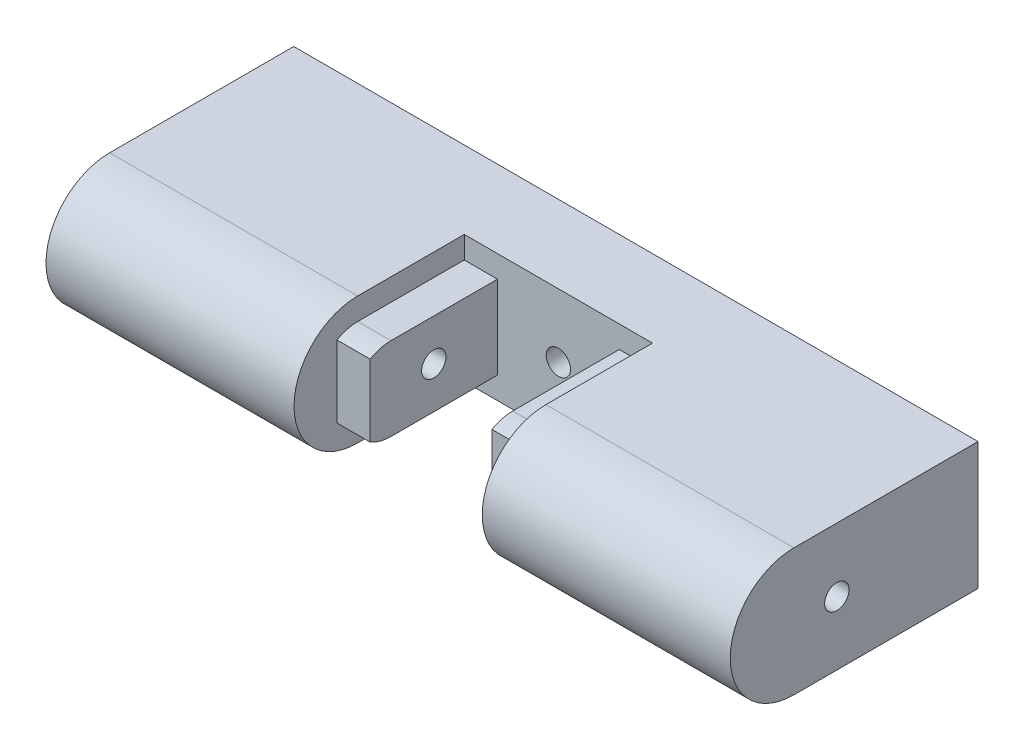
ISO-10303-21;
HEADER;
FILE_DESCRIPTION(('STEP AP214'),'2;1');
FILE_NAME('part.step','',(''),(''),'','','');
FILE_SCHEMA(('AUTOMOTIVE_DESIGN { 1 0 10303 214 1 1 1 1 }'));
ENDSEC;
DATA;
#1=APPLICATION_CONTEXT('core data for automotive mechanical design processes');
#2=APPLICATION_PROTOCOL_DEFINITION('international standard','automotive_design',2000,#1);
#3=PRODUCT_CONTEXT('',#1,'mechanical');
#4=PRODUCT('Part','Part','',(#3));
#5=PRODUCT_RELATED_PRODUCT_CATEGORY('part','',(#4));
#6=PRODUCT_DEFINITION_FORMATION('','',#4);
#7=PRODUCT_DEFINITION_CONTEXT('part definition',#1,'design');
#8=PRODUCT_DEFINITION('design','',#6,#7);
#9=PRODUCT_DEFINITION_SHAPE('','',#8);
#10=(LENGTH_UNIT() NAMED_UNIT(*) SI_UNIT(.MILLI.,.METRE.));
#11=(NAMED_UNIT(*) PLANE_ANGLE_UNIT() SI_UNIT($,.RADIAN.));
#12=(NAMED_UNIT(*) SI_UNIT($,.STERADIAN.) SOLID_ANGLE_UNIT());
#13=UNCERTAINTY_MEASURE_WITH_UNIT(LENGTH_MEASURE(1.E-05),#10,'distance_accuracy_value','');
#14=(GEOMETRIC_REPRESENTATION_CONTEXT(3) GLOBAL_UNCERTAINTY_ASSIGNED_CONTEXT((#13)) GLOBAL_UNIT_ASSIGNED_CONTEXT((#10,
#11,#12)) REPRESENTATION_CONTEXT('',''));
#15=CARTESIAN_POINT('',(0.,0.,0.));
#16=DIRECTION('',(0.,0.,1.));
#17=DIRECTION('',(1.,0.,0.));
#18=AXIS2_PLACEMENT_3D('',#15,#16,#17);
#19=CARTESIAN_POINT('',(5.5,4.75,5.75));
#20=DIRECTION('',(1.,0.,0.));
#21=DIRECTION('',(0.,0.,-1.));
#22=AXIS2_PLACEMENT_3D('',#19,#20,#21);
#23=PLANE('',#22);
#24=CARTESIAN_POINT('',(5.5,0.,0.));
#25=DIRECTION('',(1.,0.,0.));
#26=DIRECTION('',(0.,0.,-1.));
#27=AXIS2_PLACEMENT_3D('',#24,#25,#26);
#28=CIRCLE('',#27,1.1);
#29=CARTESIAN_POINT('',(5.5,0.,-1.1));
#30=VERTEX_POINT('',#29);
#31=EDGE_CURVE('E334',#30,#30,#28,.T.);
#32=ORIENTED_EDGE('',*,*,#31,.T.);
#33=EDGE_LOOP('',(#32));
#34=FACE_BOUND('',#33,.T.);
#35=DIRECTION('',(0.,0.,1.));
#36=VECTOR('',#35,1.);
#37=CARTESIAN_POINT('',(5.5,3.75,5.75));
#38=LINE('',#37,#36);
#39=CARTESIAN_POINT('',(5.5,3.75,-5.75));
#40=VERTEX_POINT('',#39);
#41=CARTESIAN_POINT('',(5.5,3.75,3.875));
#42=VERTEX_POINT('',#41);
#43=EDGE_CURVE('E297',#40,#42,#38,.T.);
#44=ORIENTED_EDGE('',*,*,#43,.F.);
#45=DIRECTION('',(0.,-1.,0.));
#46=VECTOR('',#45,1.);
#47=CARTESIAN_POINT('',(5.5,4.75,-5.75));
#48=LINE('',#47,#46);
#49=CARTESIAN_POINT('',(5.5,-3.75,-5.75));
#50=VERTEX_POINT('',#49);
#51=EDGE_CURVE('E337',#40,#50,#48,.T.);
#52=ORIENTED_EDGE('',*,*,#51,.T.);
#53=DIRECTION('',(0.,0.,-1.));
#54=VECTOR('',#53,1.);
#55=CARTESIAN_POINT('',(5.5,-3.75,5.75));
#56=LINE('',#55,#54);
#57=CARTESIAN_POINT('',(5.5,-3.75,3.875));
#58=VERTEX_POINT('',#57);
#59=EDGE_CURVE('E295',#58,#50,#56,.T.);
#60=ORIENTED_EDGE('',*,*,#59,.F.);
#61=CARTESIAN_POINT('',(5.5,0.,3.875));
#62=DIRECTION('',(1.,0.,0.));
#63=DIRECTION('',(0.,0.,-1.));
#64=AXIS2_PLACEMENT_3D('',#61,#62,#63);
#65=CIRCLE('',#64,3.75);
#66=CARTESIAN_POINT('',(5.5,-3.24759526419164,5.75));
#67=VERTEX_POINT('',#66);
#68=EDGE_CURVE('E303',#67,#58,#65,.T.);
#69=ORIENTED_EDGE('',*,*,#68,.F.);
#70=DIRECTION('',(0.,-1.,0.));
#71=VECTOR('',#70,1.);
#72=CARTESIAN_POINT('',(5.5,4.75,5.75));
#73=LINE('',#72,#71);
#74=CARTESIAN_POINT('',(5.5,3.24759526419164,5.75));
#75=VERTEX_POINT('',#74);
#76=EDGE_CURVE('E301',#75,#67,#73,.T.);
#77=ORIENTED_EDGE('',*,*,#76,.F.);
#78=CARTESIAN_POINT('',(5.5,0.,3.875));
#79=DIRECTION('',(1.,0.,0.));
#80=DIRECTION('',(0.,0.,-1.));
#81=AXIS2_PLACEMENT_3D('',#78,#79,#80);
#82=CIRCLE('',#81,3.75);
#83=EDGE_CURVE('E299',#42,#75,#82,.T.);
#84=ORIENTED_EDGE('',*,*,#83,.F.);
#85=EDGE_LOOP('',(#44,#52,#60,#69,#77,#84));
#86=FACE_BOUND('',#85,.T.);
#87=ADVANCED_FACE('F47',(#34,#86),#23,.F.);
#88=CARTESIAN_POINT('',(-5.5,4.75,5.75));
#89=DIRECTION('',(-1.,0.,0.));
#90=DIRECTION('',(0.,0.,1.));
#91=AXIS2_PLACEMENT_3D('',#88,#89,#90);
#92=PLANE('',#91);
#93=CARTESIAN_POINT('',(-5.5,0.,0.));
#94=DIRECTION('',(-1.,0.,0.));
#95=DIRECTION('',(0.,0.,1.));
#96=AXIS2_PLACEMENT_3D('',#93,#94,#95);
#97=CIRCLE('',#96,1.1);
#98=CARTESIAN_POINT('',(-5.5,0.,1.1));
#99=VERTEX_POINT('',#98);
#100=EDGE_CURVE('E333',#99,#99,#97,.T.);
#101=ORIENTED_EDGE('',*,*,#100,.T.);
#102=EDGE_LOOP('',(#101));
#103=FACE_BOUND('',#102,.T.);
#104=DIRECTION('',(0.,0.,-1.));
#105=VECTOR('',#104,1.);
#106=CARTESIAN_POINT('',(-5.5,3.75,5.75));
#107=LINE('',#106,#105);
#108=CARTESIAN_POINT('',(-5.5,3.75,3.875));
#109=VERTEX_POINT('',#108);
#110=CARTESIAN_POINT('',(-5.5,3.75,-5.75));
#111=VERTEX_POINT('',#110);
#112=EDGE_CURVE('E11',#109,#111,#107,.T.);
#113=ORIENTED_EDGE('',*,*,#112,.F.);
#114=CARTESIAN_POINT('',(-5.5,0.,3.875));
#115=DIRECTION('',(-1.,0.,0.));
#116=DIRECTION('',(0.,0.,1.));
#117=AXIS2_PLACEMENT_3D('',#114,#115,#116);
#118=CIRCLE('',#117,3.75);
#119=CARTESIAN_POINT('',(-5.5,3.24759526419164,5.75));
#120=VERTEX_POINT('',#119);
#121=EDGE_CURVE('E55',#120,#109,#118,.T.);
#122=ORIENTED_EDGE('',*,*,#121,.F.);
#123=DIRECTION('',(0.,1.,0.));
#124=VECTOR('',#123,1.);
#125=CARTESIAN_POINT('',(-5.5,4.75,5.75));
#126=LINE('',#125,#124);
#127=CARTESIAN_POINT('',(-5.5,-3.24759526419164,5.75));
#128=VERTEX_POINT('',#127);
#129=EDGE_CURVE('E349',#128,#120,#126,.T.);
#130=ORIENTED_EDGE('',*,*,#129,.F.);
#131=CARTESIAN_POINT('',(-5.5,0.,3.875));
#132=DIRECTION('',(-1.,0.,0.));
#133=DIRECTION('',(0.,0.,1.));
#134=AXIS2_PLACEMENT_3D('',#131,#132,#133);
#135=CIRCLE('',#134,3.75);
#136=CARTESIAN_POINT('',(-5.5,-3.75,3.875));
#137=VERTEX_POINT('',#136);
#138=EDGE_CURVE('E347',#137,#128,#135,.T.);
#139=ORIENTED_EDGE('',*,*,#138,.F.);
#140=DIRECTION('',(0.,0.,1.));
#141=VECTOR('',#140,1.);
#142=CARTESIAN_POINT('',(-5.5,-3.75,5.75));
#143=LINE('',#142,#141);
#144=CARTESIAN_POINT('',(-5.5,-3.75,-5.75));
#145=VERTEX_POINT('',#144);
#146=EDGE_CURVE('E343',#145,#137,#143,.T.);
#147=ORIENTED_EDGE('',*,*,#146,.F.);
#148=DIRECTION('',(0.,-1.,0.));
#149=VECTOR('',#148,1.);
#150=CARTESIAN_POINT('',(-5.5,4.75,-5.75));
#151=LINE('',#150,#149);
#152=EDGE_CURVE('E340',#111,#145,#151,.T.);
#153=ORIENTED_EDGE('',*,*,#152,.F.);
#154=EDGE_LOOP('',(#113,#122,#130,#139,#147,#153));
#155=FACE_BOUND('',#154,.T.);
#156=ADVANCED_FACE('F364',(#103,#155),#92,.F.);
#157=CARTESIAN_POINT('',(0.,-5.75,0.));
#158=DIRECTION('',(0.,1.,0.));
#159=DIRECTION('',(0.,0.,1.));
#160=AXIS2_PLACEMENT_3D('',#157,#158,#159);
#161=PLANE('',#160);
#162=DIRECTION('',(0.,0.,-1.));
#163=VECTOR('',#162,1.);
#164=CARTESIAN_POINT('',(8.5,-5.75,3.87499999999998));
#165=LINE('',#164,#163);
#166=CARTESIAN_POINT('',(8.5,-5.75,3.87499999999998));
#167=VERTEX_POINT('',#166);
#168=CARTESIAN_POINT('',(8.5,-5.75,-5.75));
#169=VERTEX_POINT('',#168);
#170=EDGE_CURVE('E70',#167,#169,#165,.T.);
#171=ORIENTED_EDGE('',*,*,#170,.T.);
#172=DIRECTION('',(1.,0.,0.));
#173=VECTOR('',#172,1.);
#174=CARTESIAN_POINT('',(-6.5,-5.75,-5.75));
#175=LINE('',#174,#173);
#176=CARTESIAN_POINT('',(-8.5,-5.75,-5.75));
#177=VERTEX_POINT('',#176);
#178=EDGE_CURVE('E331',#177,#169,#175,.T.);
#179=ORIENTED_EDGE('',*,*,#178,.F.);
#180=DIRECTION('',(0.,0.,-1.));
#181=VECTOR('',#180,1.);
#182=CARTESIAN_POINT('',(-8.5,-5.75,3.87499999999998));
#183=LINE('',#182,#181);
#184=CARTESIAN_POINT('',(-8.5,-5.75,3.87499999999998));
#185=VERTEX_POINT('',#184);
#186=EDGE_CURVE('E241',#185,#177,#183,.T.);
#187=ORIENTED_EDGE('',*,*,#186,.F.);
#188=DIRECTION('',(1.,0.,0.));
#189=VECTOR('',#188,1.);
#190=CARTESIAN_POINT('',(-30.9,-5.75,3.875));
#191=LINE('',#190,#189);
#192=CARTESIAN_POINT('',(-30.9,-5.75,3.875));
#193=VERTEX_POINT('',#192);
#194=EDGE_CURVE('E326',#193,#185,#191,.T.);
#195=ORIENTED_EDGE('',*,*,#194,.F.);
#196=DIRECTION('',(0.,0.,1.));
#197=VECTOR('',#196,1.);
#198=CARTESIAN_POINT('',(-30.9,-5.75,0.));
#199=LINE('',#198,#197);
#200=CARTESIAN_POINT('',(-30.9,-5.75,-12.75));
#201=VERTEX_POINT('',#200);
#202=EDGE_CURVE('E203',#201,#193,#199,.T.);
#203=ORIENTED_EDGE('',*,*,#202,.F.);
#204=DIRECTION('',(-1.,0.,0.));
#205=VECTOR('',#204,1.);
#206=CARTESIAN_POINT('',(30.9,-5.75,-12.75));
#207=LINE('',#206,#205);
#208=CARTESIAN_POINT('',(30.9,-5.75,-12.75));
#209=VERTEX_POINT('',#208);
#210=EDGE_CURVE('E199',#209,#201,#207,.T.);
#211=ORIENTED_EDGE('',*,*,#210,.F.);
#212=DIRECTION('',(0.,0.,-1.));
#213=VECTOR('',#212,1.);
#214=CARTESIAN_POINT('',(30.9,-5.75,-6.75));
#215=LINE('',#214,#213);
#216=CARTESIAN_POINT('',(30.9,-5.75,3.87499999999998));
#217=VERTEX_POINT('',#216);
#218=EDGE_CURVE('E185',#217,#209,#215,.T.);
#219=ORIENTED_EDGE('',*,*,#218,.F.);
#220=DIRECTION('',(-1.,0.,0.));
#221=VECTOR('',#220,1.);
#222=CARTESIAN_POINT('',(30.9,-5.75,3.87499999999998));
#223=LINE('',#222,#221);
#224=EDGE_CURVE('E313',#217,#167,#223,.T.);
#225=ORIENTED_EDGE('',*,*,#224,.T.);
#226=EDGE_LOOP('',(#171,#179,#187,#195,#203,#211,#219,#225));
#227=FACE_BOUND('',#226,.T.);
#228=ADVANCED_FACE('F200',(#227),#161,.F.);
#229=CARTESIAN_POINT('',(0.,5.75,0.));
#230=DIRECTION('',(0.,1.,0.));
#231=DIRECTION('',(0.,0.,1.));
#232=AXIS2_PLACEMENT_3D('',#229,#230,#231);
#233=PLANE('',#232);
#234=DIRECTION('',(1.,0.,0.));
#235=VECTOR('',#234,1.);
#236=CARTESIAN_POINT('',(-6.5,5.75,-5.75));
#237=LINE('',#236,#235);
#238=CARTESIAN_POINT('',(-8.5,5.75,-5.75));
#239=VERTEX_POINT('',#238);
#240=CARTESIAN_POINT('',(8.5,5.75,-5.75));
#241=VERTEX_POINT('',#240);
#242=EDGE_CURVE('E329',#239,#241,#237,.T.);
#243=ORIENTED_EDGE('',*,*,#242,.T.);
#244=DIRECTION('',(0.,0.,1.));
#245=VECTOR('',#244,1.);
#246=CARTESIAN_POINT('',(8.5,5.75,3.87500000000002));
#247=LINE('',#246,#245);
#248=CARTESIAN_POINT('',(8.5,5.75,3.87500000000002));
#249=VERTEX_POINT('',#248);
#250=EDGE_CURVE('E262',#241,#249,#247,.T.);
#251=ORIENTED_EDGE('',*,*,#250,.T.);
#252=DIRECTION('',(-1.,0.,0.));
#253=VECTOR('',#252,1.);
#254=CARTESIAN_POINT('',(30.9,5.75,3.87500000000002));
#255=LINE('',#254,#253);
#256=CARTESIAN_POINT('',(30.9,5.75,3.87500000000002));
#257=VERTEX_POINT('',#256);
#258=EDGE_CURVE('E310',#257,#249,#255,.T.);
#259=ORIENTED_EDGE('',*,*,#258,.F.);
#260=DIRECTION('',(0.,0.,1.));
#261=VECTOR('',#260,1.);
#262=CARTESIAN_POINT('',(30.9,5.75,3.87500000000002));
#263=LINE('',#262,#261);
#264=CARTESIAN_POINT('',(30.9,5.75,-12.75));
#265=VERTEX_POINT('',#264);
#266=EDGE_CURVE('E196',#265,#257,#263,.T.);
#267=ORIENTED_EDGE('',*,*,#266,.F.);
#268=DIRECTION('',(1.,0.,0.));
#269=VECTOR('',#268,1.);
#270=CARTESIAN_POINT('',(30.9,5.75,-12.75));
#271=LINE('',#270,#269);
#272=CARTESIAN_POINT('',(-30.9,5.75,-12.75));
#273=VERTEX_POINT('',#272);
#274=EDGE_CURVE('E213',#273,#265,#271,.T.);
#275=ORIENTED_EDGE('',*,*,#274,.F.);
#276=DIRECTION('',(0.,0.,-1.));
#277=VECTOR('',#276,1.);
#278=CARTESIAN_POINT('',(-30.9,5.75,0.));
#279=LINE('',#278,#277);
#280=CARTESIAN_POINT('',(-30.9,5.75,3.875));
#281=VERTEX_POINT('',#280);
#282=EDGE_CURVE('E318',#281,#273,#279,.T.);
#283=ORIENTED_EDGE('',*,*,#282,.F.);
#284=DIRECTION('',(1.,0.,0.));
#285=VECTOR('',#284,1.);
#286=CARTESIAN_POINT('',(-30.9,5.75,3.875));
#287=LINE('',#286,#285);
#288=CARTESIAN_POINT('',(-8.5,5.75,3.875));
#289=VERTEX_POINT('',#288);
#290=EDGE_CURVE('E323',#281,#289,#287,.T.);
#291=ORIENTED_EDGE('',*,*,#290,.T.);
#292=DIRECTION('',(0.,0.,1.));
#293=VECTOR('',#292,1.);
#294=CARTESIAN_POINT('',(-8.5,5.75,3.87500000000002));
#295=LINE('',#294,#293);
#296=EDGE_CURVE('E62',#239,#289,#295,.T.);
#297=ORIENTED_EDGE('',*,*,#296,.F.);
#298=EDGE_LOOP('',(#243,#251,#259,#267,#275,#283,#291,#297));
#299=FACE_BOUND('',#298,.T.);
#300=ADVANCED_FACE('F393',(#299),#233,.T.);
#301=CARTESIAN_POINT('',(-30.9,0.,3.875));
#302=DIRECTION('',(1.,0.,0.));
#303=DIRECTION('',(0.,0.,-1.));
#304=AXIS2_PLACEMENT_3D('',#301,#302,#303);
#305=CYLINDRICAL_SURFACE('',#304,5.75);
#306=CARTESIAN_POINT('',(-8.5,0.,3.875));
#307=DIRECTION('',(1.,0.,0.));
#308=DIRECTION('',(0.,0.,-1.));
#309=AXIS2_PLACEMENT_3D('',#306,#307,#308);
#310=CIRCLE('',#309,5.75);
#311=EDGE_CURVE('E239',#289,#185,#310,.T.);
#312=ORIENTED_EDGE('',*,*,#311,.F.);
#313=ORIENTED_EDGE('',*,*,#290,.F.);
#314=CARTESIAN_POINT('',(-30.9,0.,3.875));
#315=DIRECTION('',(-1.,0.,0.));
#316=DIRECTION('',(0.,0.,1.));
#317=AXIS2_PLACEMENT_3D('',#314,#315,#316);
#318=CIRCLE('',#317,5.75);
#319=EDGE_CURVE('E316',#193,#281,#318,.T.);
#320=ORIENTED_EDGE('',*,*,#319,.F.);
#321=ORIENTED_EDGE('',*,*,#194,.T.);
#322=EDGE_LOOP('',(#312,#313,#320,#321));
#323=FACE_BOUND('',#322,.T.);
#324=ADVANCED_FACE('F445',(#323),#305,.T.);
#325=CARTESIAN_POINT('',(5.5,4.75,-5.75));
#326=DIRECTION('',(0.,0.,-1.));
#327=DIRECTION('',(-1.,0.,0.));
#328=AXIS2_PLACEMENT_3D('',#325,#326,#327);
#329=PLANE('',#328);
#330=CARTESIAN_POINT('',(0.,0.,-5.75));
#331=DIRECTION('',(0.,0.,1.));
#332=DIRECTION('',(1.,0.,0.));
#333=AXIS2_PLACEMENT_3D('',#330,#331,#332);
#334=CIRCLE('',#333,1.1);
#335=CARTESIAN_POINT('',(1.1,0.,-5.75));
#336=VERTEX_POINT('',#335);
#337=EDGE_CURVE('E221',#336,#336,#334,.T.);
#338=ORIENTED_EDGE('',*,*,#337,.F.);
#339=EDGE_LOOP('',(#338));
#340=FACE_BOUND('',#339,.T.);
#341=DIRECTION('',(-1.,0.,0.));
#342=VECTOR('',#341,1.);
#343=CARTESIAN_POINT('',(8.5,-3.75,-5.75));
#344=LINE('',#343,#342);
#345=CARTESIAN_POINT('',(8.5,-3.75,-5.75));
#346=VERTEX_POINT('',#345);
#347=EDGE_CURVE('E277',#346,#50,#344,.T.);
#348=ORIENTED_EDGE('',*,*,#347,.T.);
#349=ORIENTED_EDGE('',*,*,#51,.F.);
#350=DIRECTION('',(-1.,0.,0.));
#351=VECTOR('',#350,1.);
#352=CARTESIAN_POINT('',(8.5,3.75,-5.75));
#353=LINE('',#352,#351);
#354=CARTESIAN_POINT('',(8.5,3.75,-5.75));
#355=VERTEX_POINT('',#354);
#356=EDGE_CURVE('E281',#355,#40,#353,.T.);
#357=ORIENTED_EDGE('',*,*,#356,.F.);
#358=DIRECTION('',(0.,1.,0.));
#359=VECTOR('',#358,1.);
#360=CARTESIAN_POINT('',(8.5,3.75,-5.75));
#361=LINE('',#360,#359);
#362=EDGE_CURVE('E259',#355,#241,#361,.T.);
#363=ORIENTED_EDGE('',*,*,#362,.T.);
#364=ORIENTED_EDGE('',*,*,#242,.F.);
#365=DIRECTION('',(0.,1.,0.));
#366=VECTOR('',#365,1.);
#367=CARTESIAN_POINT('',(-8.5,3.75,-5.75));
#368=LINE('',#367,#366);
#369=CARTESIAN_POINT('',(-8.5,3.75,-5.75));
#370=VERTEX_POINT('',#369);
#371=EDGE_CURVE('E236',#370,#239,#368,.T.);
#372=ORIENTED_EDGE('',*,*,#371,.F.);
#373=EDGE_CURVE('E280',#111,#370,#353,.T.);
#374=ORIENTED_EDGE('',*,*,#373,.F.);
#375=ORIENTED_EDGE('',*,*,#152,.T.);
#376=CARTESIAN_POINT('',(-8.5,-3.75,-5.75));
#377=VERTEX_POINT('',#376);
#378=EDGE_CURVE('E276',#145,#377,#344,.T.);
#379=ORIENTED_EDGE('',*,*,#378,.T.);
#380=DIRECTION('',(0.,1.,0.));
#381=VECTOR('',#380,1.);
#382=CARTESIAN_POINT('',(-8.5,-4.75,-5.75));
#383=LINE('',#382,#381);
#384=EDGE_CURVE('E244',#177,#377,#383,.T.);
#385=ORIENTED_EDGE('',*,*,#384,.F.);
#386=ORIENTED_EDGE('',*,*,#178,.T.);
#387=DIRECTION('',(0.,1.,0.));
#388=VECTOR('',#387,1.);
#389=CARTESIAN_POINT('',(8.5,-4.75,-5.75));
#390=LINE('',#389,#388);
#391=EDGE_CURVE('E268',#169,#346,#390,.T.);
#392=ORIENTED_EDGE('',*,*,#391,.T.);
#393=EDGE_LOOP('',(#348,#349,#357,#363,#364,#372,#374,#375,#379,#385,#386,#392));
#394=FACE_BOUND('',#393,.T.);
#395=ADVANCED_FACE('F49',(#340,#394),#329,.F.);
#396=CARTESIAN_POINT('',(-9.61126983722081,0.,0.));
#397=DIRECTION('',(1.,0.,0.));
#398=DIRECTION('',(0.,0.,-1.));
#399=AXIS2_PLACEMENT_3D('',#396,#397,#398);
#400=CYLINDRICAL_SURFACE('',#399,1.1);
#401=ORIENTED_EDGE('',*,*,#100,.F.);
#402=EDGE_LOOP('',(#401));
#403=FACE_BOUND('',#402,.T.);
#404=CARTESIAN_POINT('',(-30.9,0.,0.));
#405=DIRECTION('',(-1.,0.,0.));
#406=DIRECTION('',(0.,0.,1.));
#407=AXIS2_PLACEMENT_3D('',#404,#405,#406);
#408=CIRCLE('',#407,1.1);
#409=CARTESIAN_POINT('',(-30.9,0.,1.1));
#410=VERTEX_POINT('',#409);
#411=EDGE_CURVE('E320',#410,#410,#408,.F.);
#412=ORIENTED_EDGE('',*,*,#411,.F.);
#413=EDGE_LOOP('',(#412));
#414=FACE_BOUND('',#413,.T.);
#415=ADVANCED_FACE('F439',(#403,#414),#400,.F.);
#416=ORIENTED_EDGE('',*,*,#31,.F.);
#417=EDGE_LOOP('',(#416));
#418=FACE_BOUND('',#417,.T.);
#419=CARTESIAN_POINT('',(30.9,0.,0.));
#420=DIRECTION('',(1.,0.,0.));
#421=DIRECTION('',(0.,0.,-1.));
#422=AXIS2_PLACEMENT_3D('',#419,#420,#421);
#423=CIRCLE('',#422,1.1);
#424=CARTESIAN_POINT('',(30.9,0.,-1.1));
#425=VERTEX_POINT('',#424);
#426=EDGE_CURVE('E305',#425,#425,#423,.T.);
#427=ORIENTED_EDGE('',*,*,#426,.T.);
#428=EDGE_LOOP('',(#427));
#429=FACE_BOUND('',#428,.T.);
#430=ADVANCED_FACE('F436',(#418,#429),#400,.F.);
#431=CARTESIAN_POINT('',(-30.9,0.,0.));
#432=DIRECTION('',(-1.,0.,0.));
#433=DIRECTION('',(0.,0.,1.));
#434=AXIS2_PLACEMENT_3D('',#431,#432,#433);
#435=PLANE('',#434);
#436=ORIENTED_EDGE('',*,*,#202,.T.);
#437=ORIENTED_EDGE('',*,*,#319,.T.);
#438=ORIENTED_EDGE('',*,*,#282,.T.);
#439=DIRECTION('',(0.,1.,0.));
#440=VECTOR('',#439,1.);
#441=CARTESIAN_POINT('',(-30.9,5.75,-12.75));
#442=LINE('',#441,#440);
#443=EDGE_CURVE('E207',#201,#273,#442,.T.);
#444=ORIENTED_EDGE('',*,*,#443,.F.);
#445=EDGE_LOOP('',(#436,#437,#438,#444));
#446=FACE_BOUND('',#445,.T.);
#447=ORIENTED_EDGE('',*,*,#411,.T.);
#448=EDGE_LOOP('',(#447));
#449=FACE_BOUND('',#448,.T.);
#450=ADVANCED_FACE('F438',(#446,#449),#435,.T.);
#451=CARTESIAN_POINT('',(30.9,0.,3.875));
#452=DIRECTION('',(1.,0.,0.));
#453=DIRECTION('',(0.,0.,-1.));
#454=AXIS2_PLACEMENT_3D('',#451,#452,#453);
#455=PLANE('',#454);
#456=CARTESIAN_POINT('',(30.9,0.,3.875));
#457=DIRECTION('',(1.,0.,0.));
#458=DIRECTION('',(0.,0.,-1.));
#459=AXIS2_PLACEMENT_3D('',#456,#457,#458);
#460=CIRCLE('',#459,5.75);
#461=EDGE_CURVE('E192',#257,#217,#460,.T.);
#462=ORIENTED_EDGE('',*,*,#461,.T.);
#463=ORIENTED_EDGE('',*,*,#218,.T.);
#464=DIRECTION('',(0.,-1.,0.));
#465=VECTOR('',#464,1.);
#466=CARTESIAN_POINT('',(30.9,5.75,-12.75));
#467=LINE('',#466,#465);
#468=EDGE_CURVE('E190',#265,#209,#467,.T.);
#469=ORIENTED_EDGE('',*,*,#468,.F.);
#470=ORIENTED_EDGE('',*,*,#266,.T.);
#471=EDGE_LOOP('',(#462,#463,#469,#470));
#472=FACE_BOUND('',#471,.T.);
#473=ORIENTED_EDGE('',*,*,#426,.F.);
#474=EDGE_LOOP('',(#473));
#475=FACE_BOUND('',#474,.T.);
#476=ADVANCED_FACE('F187',(#472,#475),#455,.T.);
#477=CARTESIAN_POINT('',(30.9,0.,3.875));
#478=DIRECTION('',(-1.,0.,0.));
#479=DIRECTION('',(0.,0.,1.));
#480=AXIS2_PLACEMENT_3D('',#477,#478,#479);
#481=CYLINDRICAL_SURFACE('',#480,5.75);
#482=ORIENTED_EDGE('',*,*,#258,.T.);
#483=CARTESIAN_POINT('',(8.5,0.,3.875));
#484=DIRECTION('',(1.,0.,0.));
#485=DIRECTION('',(0.,0.,-1.));
#486=AXIS2_PLACEMENT_3D('',#483,#484,#485);
#487=CIRCLE('',#486,5.75);
#488=EDGE_CURVE('E265',#249,#167,#487,.T.);
#489=ORIENTED_EDGE('',*,*,#488,.T.);
#490=ORIENTED_EDGE('',*,*,#224,.F.);
#491=ORIENTED_EDGE('',*,*,#461,.F.);
#492=EDGE_LOOP('',(#482,#489,#490,#491));
#493=FACE_BOUND('',#492,.T.);
#494=ADVANCED_FACE('F388',(#493),#481,.T.);
#495=CARTESIAN_POINT('',(8.5,0.,3.875));
#496=DIRECTION('',(1.,0.,0.));
#497=DIRECTION('',(0.,0.,-1.));
#498=AXIS2_PLACEMENT_3D('',#495,#496,#497);
#499=PLANE('',#498);
#500=CARTESIAN_POINT('',(8.5,0.,3.875));
#501=DIRECTION('',(-1.,0.,0.));
#502=DIRECTION('',(0.,0.,-1.));
#503=AXIS2_PLACEMENT_3D('',#500,#501,#502);
#504=CIRCLE('',#503,3.75);
#505=CARTESIAN_POINT('',(8.5,-3.75,3.875));
#506=VERTEX_POINT('',#505);
#507=CARTESIAN_POINT('',(8.5,-3.24759526419164,5.75));
#508=VERTEX_POINT('',#507);
#509=EDGE_CURVE('E250',#506,#508,#504,.T.);
#510=ORIENTED_EDGE('',*,*,#509,.F.);
#511=DIRECTION('',(0.,0.,1.));
#512=VECTOR('',#511,1.);
#513=CARTESIAN_POINT('',(8.5,-3.75,3.875));
#514=LINE('',#513,#512);
#515=EDGE_CURVE('E270',#346,#506,#514,.T.);
#516=ORIENTED_EDGE('',*,*,#515,.F.);
#517=ORIENTED_EDGE('',*,*,#391,.F.);
#518=ORIENTED_EDGE('',*,*,#170,.F.);
#519=ORIENTED_EDGE('',*,*,#488,.F.);
#520=ORIENTED_EDGE('',*,*,#250,.F.);
#521=ORIENTED_EDGE('',*,*,#362,.F.);
#522=DIRECTION('',(0.,0.,-1.));
#523=VECTOR('',#522,1.);
#524=CARTESIAN_POINT('',(8.5,3.75,3.875));
#525=LINE('',#524,#523);
#526=CARTESIAN_POINT('',(8.5,3.75,3.875));
#527=VERTEX_POINT('',#526);
#528=EDGE_CURVE('E257',#527,#355,#525,.T.);
#529=ORIENTED_EDGE('',*,*,#528,.F.);
#530=CARTESIAN_POINT('',(8.5,0.,3.875));
#531=DIRECTION('',(-1.,0.,0.));
#532=DIRECTION('',(0.,0.,-1.));
#533=AXIS2_PLACEMENT_3D('',#530,#531,#532);
#534=CIRCLE('',#533,3.75);
#535=CARTESIAN_POINT('',(8.5,3.24759526419164,5.75));
#536=VERTEX_POINT('',#535);
#537=EDGE_CURVE('E255',#536,#527,#534,.T.);
#538=ORIENTED_EDGE('',*,*,#537,.F.);
#539=DIRECTION('',(0.,1.,0.));
#540=VECTOR('',#539,1.);
#541=CARTESIAN_POINT('',(8.5,-3.24759526419164,5.75));
#542=LINE('',#541,#540);
#543=EDGE_CURVE('E253',#508,#536,#542,.T.);
#544=ORIENTED_EDGE('',*,*,#543,.F.);
#545=EDGE_LOOP('',(#510,#516,#517,#518,#519,#520,#521,#529,#538,#544));
#546=FACE_BOUND('',#545,.T.);
#547=ADVANCED_FACE('F386',(#546),#499,.F.);
#548=CARTESIAN_POINT('',(8.5,-3.75,3.875));
#549=DIRECTION('',(0.,-1.,0.));
#550=DIRECTION('',(0.,0.,-1.));
#551=AXIS2_PLACEMENT_3D('',#548,#549,#550);
#552=PLANE('',#551);
#553=ORIENTED_EDGE('',*,*,#59,.T.);
#554=ORIENTED_EDGE('',*,*,#347,.F.);
#555=ORIENTED_EDGE('',*,*,#515,.T.);
#556=DIRECTION('',(-1.,0.,0.));
#557=VECTOR('',#556,1.);
#558=CARTESIAN_POINT('',(8.5,-3.75,3.875));
#559=LINE('',#558,#557);
#560=EDGE_CURVE('E273',#506,#58,#559,.T.);
#561=ORIENTED_EDGE('',*,*,#560,.T.);
#562=EDGE_LOOP('',(#553,#554,#555,#561));
#563=FACE_BOUND('',#562,.T.);
#564=ADVANCED_FACE('F417',(#563),#552,.T.);
#565=CARTESIAN_POINT('',(8.5,3.75,3.875));
#566=DIRECTION('',(0.,1.,0.));
#567=DIRECTION('',(0.,0.,1.));
#568=AXIS2_PLACEMENT_3D('',#565,#566,#567);
#569=PLANE('',#568);
#570=ORIENTED_EDGE('',*,*,#43,.T.);
#571=DIRECTION('',(-1.,0.,0.));
#572=VECTOR('',#571,1.);
#573=CARTESIAN_POINT('',(8.5,3.75,3.875));
#574=LINE('',#573,#572);
#575=EDGE_CURVE('E284',#527,#42,#574,.T.);
#576=ORIENTED_EDGE('',*,*,#575,.F.);
#577=ORIENTED_EDGE('',*,*,#528,.T.);
#578=ORIENTED_EDGE('',*,*,#356,.T.);
#579=EDGE_LOOP('',(#570,#576,#577,#578));
#580=FACE_BOUND('',#579,.T.);
#581=ADVANCED_FACE('F400',(#580),#569,.T.);
#582=CARTESIAN_POINT('',(8.5,0.,3.875));
#583=DIRECTION('',(-1.,0.,0.));
#584=DIRECTION('',(0.,0.,1.));
#585=AXIS2_PLACEMENT_3D('',#582,#583,#584);
#586=CYLINDRICAL_SURFACE('',#585,3.75);
#587=ORIENTED_EDGE('',*,*,#83,.T.);
#588=DIRECTION('',(-1.,0.,0.));
#589=VECTOR('',#588,1.);
#590=CARTESIAN_POINT('',(8.5,3.24759526419164,5.75));
#591=LINE('',#590,#589);
#592=EDGE_CURVE('E288',#536,#75,#591,.T.);
#593=ORIENTED_EDGE('',*,*,#592,.F.);
#594=ORIENTED_EDGE('',*,*,#537,.T.);
#595=ORIENTED_EDGE('',*,*,#575,.T.);
#596=EDGE_LOOP('',(#587,#593,#594,#595));
#597=FACE_BOUND('',#596,.T.);
#598=ADVANCED_FACE('F404',(#597),#586,.T.);
#599=CARTESIAN_POINT('',(8.5,-3.24759526419164,5.75));
#600=DIRECTION('',(0.,0.,1.));
#601=DIRECTION('',(1.,0.,0.));
#602=AXIS2_PLACEMENT_3D('',#599,#600,#601);
#603=PLANE('',#602);
#604=ORIENTED_EDGE('',*,*,#76,.T.);
#605=DIRECTION('',(-1.,0.,0.));
#606=VECTOR('',#605,1.);
#607=CARTESIAN_POINT('',(8.5,-3.24759526419164,5.75));
#608=LINE('',#607,#606);
#609=EDGE_CURVE('E292',#508,#67,#608,.T.);
#610=ORIENTED_EDGE('',*,*,#609,.F.);
#611=ORIENTED_EDGE('',*,*,#543,.T.);
#612=ORIENTED_EDGE('',*,*,#592,.T.);
#613=EDGE_LOOP('',(#604,#610,#611,#612));
#614=FACE_BOUND('',#613,.T.);
#615=ADVANCED_FACE('F412',(#614),#603,.T.);
#616=CARTESIAN_POINT('',(8.5,0.,3.875));
#617=DIRECTION('',(-1.,0.,0.));
#618=DIRECTION('',(0.,0.,1.));
#619=AXIS2_PLACEMENT_3D('',#616,#617,#618);
#620=CYLINDRICAL_SURFACE('',#619,3.75);
#621=ORIENTED_EDGE('',*,*,#68,.T.);
#622=ORIENTED_EDGE('',*,*,#560,.F.);
#623=ORIENTED_EDGE('',*,*,#509,.T.);
#624=ORIENTED_EDGE('',*,*,#609,.T.);
#625=EDGE_LOOP('',(#621,#622,#623,#624));
#626=FACE_BOUND('',#625,.T.);
#627=ADVANCED_FACE('F414',(#626),#620,.T.);
#628=ORIENTED_EDGE('',*,*,#138,.T.);
#629=CARTESIAN_POINT('',(-8.5,-3.24759526419164,5.75));
#630=VERTEX_POINT('',#629);
#631=EDGE_CURVE('E291',#128,#630,#608,.T.);
#632=ORIENTED_EDGE('',*,*,#631,.T.);
#633=CARTESIAN_POINT('',(-8.5,0.,3.875));
#634=DIRECTION('',(-1.,0.,0.));
#635=DIRECTION('',(0.,0.,-1.));
#636=AXIS2_PLACEMENT_3D('',#633,#634,#635);
#637=CIRCLE('',#636,3.75);
#638=CARTESIAN_POINT('',(-8.5,-3.75,3.875));
#639=VERTEX_POINT('',#638);
#640=EDGE_CURVE('E224',#639,#630,#637,.T.);
#641=ORIENTED_EDGE('',*,*,#640,.F.);
#642=EDGE_CURVE('E272',#137,#639,#559,.T.);
#643=ORIENTED_EDGE('',*,*,#642,.F.);
#644=EDGE_LOOP('',(#628,#632,#641,#643));
#645=FACE_BOUND('',#644,.T.);
#646=ADVANCED_FACE('F378',(#645),#620,.T.);
#647=ORIENTED_EDGE('',*,*,#129,.T.);
#648=CARTESIAN_POINT('',(-8.5,3.24759526419164,5.75));
#649=VERTEX_POINT('',#648);
#650=EDGE_CURVE('E287',#120,#649,#591,.T.);
#651=ORIENTED_EDGE('',*,*,#650,.T.);
#652=DIRECTION('',(0.,1.,0.));
#653=VECTOR('',#652,1.);
#654=CARTESIAN_POINT('',(-8.5,-3.24759526419164,5.75));
#655=LINE('',#654,#653);
#656=EDGE_CURVE('E227',#630,#649,#655,.T.);
#657=ORIENTED_EDGE('',*,*,#656,.F.);
#658=ORIENTED_EDGE('',*,*,#631,.F.);
#659=EDGE_LOOP('',(#647,#651,#657,#658));
#660=FACE_BOUND('',#659,.T.);
#661=ADVANCED_FACE('F375',(#660),#603,.T.);
#662=ORIENTED_EDGE('',*,*,#121,.T.);
#663=CARTESIAN_POINT('',(-8.5,3.75,3.875));
#664=VERTEX_POINT('',#663);
#665=EDGE_CURVE('E283',#109,#664,#574,.T.);
#666=ORIENTED_EDGE('',*,*,#665,.T.);
#667=CARTESIAN_POINT('',(-8.5,0.,3.875));
#668=DIRECTION('',(-1.,0.,0.));
#669=DIRECTION('',(0.,0.,-1.));
#670=AXIS2_PLACEMENT_3D('',#667,#668,#669);
#671=CIRCLE('',#670,3.75);
#672=EDGE_CURVE('E230',#649,#664,#671,.T.);
#673=ORIENTED_EDGE('',*,*,#672,.F.);
#674=ORIENTED_EDGE('',*,*,#650,.F.);
#675=EDGE_LOOP('',(#662,#666,#673,#674));
#676=FACE_BOUND('',#675,.T.);
#677=ADVANCED_FACE('F354',(#676),#586,.T.);
#678=ORIENTED_EDGE('',*,*,#112,.T.);
#679=ORIENTED_EDGE('',*,*,#373,.T.);
#680=DIRECTION('',(0.,0.,-1.));
#681=VECTOR('',#680,1.);
#682=CARTESIAN_POINT('',(-8.5,3.75,3.875));
#683=LINE('',#682,#681);
#684=EDGE_CURVE('E233',#664,#370,#683,.T.);
#685=ORIENTED_EDGE('',*,*,#684,.F.);
#686=ORIENTED_EDGE('',*,*,#665,.F.);
#687=EDGE_LOOP('',(#678,#679,#685,#686));
#688=FACE_BOUND('',#687,.T.);
#689=ADVANCED_FACE('F361',(#688),#569,.T.);
#690=ORIENTED_EDGE('',*,*,#146,.T.);
#691=ORIENTED_EDGE('',*,*,#642,.T.);
#692=DIRECTION('',(0.,0.,1.));
#693=VECTOR('',#692,1.);
#694=CARTESIAN_POINT('',(-8.5,-3.75,3.875));
#695=LINE('',#694,#693);
#696=EDGE_CURVE('E247',#377,#639,#695,.T.);
#697=ORIENTED_EDGE('',*,*,#696,.F.);
#698=ORIENTED_EDGE('',*,*,#378,.F.);
#699=EDGE_LOOP('',(#690,#691,#697,#698));
#700=FACE_BOUND('',#699,.T.);
#701=ADVANCED_FACE('F381',(#700),#552,.T.);
#702=CARTESIAN_POINT('',(-8.5,0.,3.875));
#703=DIRECTION('',(1.,0.,0.));
#704=DIRECTION('',(0.,0.,-1.));
#705=AXIS2_PLACEMENT_3D('',#702,#703,#704);
#706=PLANE('',#705);
#707=ORIENTED_EDGE('',*,*,#640,.T.);
#708=ORIENTED_EDGE('',*,*,#656,.T.);
#709=ORIENTED_EDGE('',*,*,#672,.T.);
#710=ORIENTED_EDGE('',*,*,#684,.T.);
#711=ORIENTED_EDGE('',*,*,#371,.T.);
#712=ORIENTED_EDGE('',*,*,#296,.T.);
#713=ORIENTED_EDGE('',*,*,#311,.T.);
#714=ORIENTED_EDGE('',*,*,#186,.T.);
#715=ORIENTED_EDGE('',*,*,#384,.T.);
#716=ORIENTED_EDGE('',*,*,#696,.T.);
#717=EDGE_LOOP('',(#707,#708,#709,#710,#711,#712,#713,#714,#715,#716));
#718=FACE_BOUND('',#717,.T.);
#719=ADVANCED_FACE('F370',(#718),#706,.T.);
#720=CARTESIAN_POINT('',(0.,0.,-9.86126983722081));
#721=DIRECTION('',(0.,0.,1.));
#722=DIRECTION('',(1.,0.,0.));
#723=AXIS2_PLACEMENT_3D('',#720,#721,#722);
#724=CYLINDRICAL_SURFACE('',#723,1.1);
#725=ORIENTED_EDGE('',*,*,#337,.T.);
#726=EDGE_LOOP('',(#725));
#727=FACE_BOUND('',#726,.T.);
#728=CARTESIAN_POINT('',(0.,0.,-12.75));
#729=DIRECTION('',(0.,0.,-1.));
#730=DIRECTION('',(-1.,0.,0.));
#731=AXIS2_PLACEMENT_3D('',#728,#729,#730);
#732=CIRCLE('',#731,1.1);
#733=CARTESIAN_POINT('',(-1.1,0.,-12.75));
#734=VERTEX_POINT('',#733);
#735=EDGE_CURVE('E214',#734,#734,#732,.T.);
#736=ORIENTED_EDGE('',*,*,#735,.T.);
#737=EDGE_LOOP('',(#736));
#738=FACE_BOUND('',#737,.T.);
#739=ADVANCED_FACE('F584',(#727,#738),#724,.F.);
#740=CARTESIAN_POINT('',(0.,0.,-12.75));
#741=DIRECTION('',(0.,0.,-1.));
#742=DIRECTION('',(-1.,0.,0.));
#743=AXIS2_PLACEMENT_3D('',#740,#741,#742);
#744=PLANE('',#743);
#745=ORIENTED_EDGE('',*,*,#468,.T.);
#746=ORIENTED_EDGE('',*,*,#210,.T.);
#747=ORIENTED_EDGE('',*,*,#443,.T.);
#748=ORIENTED_EDGE('',*,*,#274,.T.);
#749=EDGE_LOOP('',(#745,#746,#747,#748));
#750=FACE_BOUND('',#749,.T.);
#751=ORIENTED_EDGE('',*,*,#735,.F.);
#752=EDGE_LOOP('',(#751));
#753=FACE_BOUND('',#752,.T.);
#754=ADVANCED_FACE('F210',(#750,#753),#744,.T.);
#755=CLOSED_SHELL('',(#87,#156,#228,#300,#324,#395,#415,#430,#450,#476,#494,#547,#564,#581,#598,
#615,#627,#646,#661,#677,#689,#701,#719,#739,#754));
#756=MANIFOLD_SOLID_BREP('B2',#755);
#757=ADVANCED_BREP_SHAPE_REPRESENTATION('',(#18,#756),#14);
#758=SHAPE_DEFINITION_REPRESENTATION(#9,#757);
ENDSEC;
END-ISO-10303-21;
